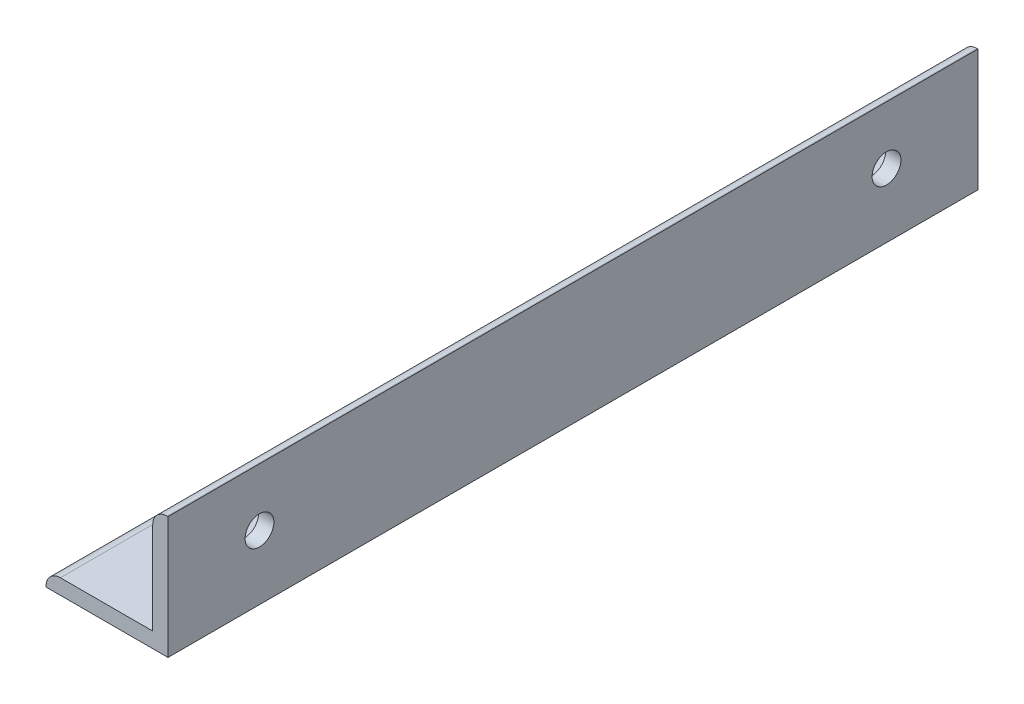
ISO-10303-21;
HEADER;
FILE_DESCRIPTION(('STEP AP214'),'2;1');
FILE_NAME('part.step','',(''),(''),'','','');
FILE_SCHEMA(('AUTOMOTIVE_DESIGN { 1 0 10303 214 1 1 1 1 }'));
ENDSEC;
DATA;
#1=APPLICATION_CONTEXT('core data for automotive mechanical design processes');
#2=APPLICATION_PROTOCOL_DEFINITION('international standard','automotive_design',2000,#1);
#3=PRODUCT_CONTEXT('',#1,'mechanical');
#4=PRODUCT('Part','Part','',(#3));
#5=PRODUCT_RELATED_PRODUCT_CATEGORY('part','',(#4));
#6=PRODUCT_DEFINITION_FORMATION('','',#4);
#7=PRODUCT_DEFINITION_CONTEXT('part definition',#1,'design');
#8=PRODUCT_DEFINITION('design','',#6,#7);
#9=PRODUCT_DEFINITION_SHAPE('','',#8);
#10=(LENGTH_UNIT() NAMED_UNIT(*) SI_UNIT(.MILLI.,.METRE.));
#11=(NAMED_UNIT(*) PLANE_ANGLE_UNIT() SI_UNIT($,.RADIAN.));
#12=(NAMED_UNIT(*) SI_UNIT($,.STERADIAN.) SOLID_ANGLE_UNIT());
#13=UNCERTAINTY_MEASURE_WITH_UNIT(LENGTH_MEASURE(1.E-05),#10,'distance_accuracy_value','');
#14=(GEOMETRIC_REPRESENTATION_CONTEXT(3) GLOBAL_UNCERTAINTY_ASSIGNED_CONTEXT((#13)) GLOBAL_UNIT_ASSIGNED_CONTEXT((#10,
#11,#12)) REPRESENTATION_CONTEXT('',''));
#15=CARTESIAN_POINT('',(0.,0.,0.));
#16=DIRECTION('',(0.,0.,1.));
#17=DIRECTION('',(1.,0.,0.));
#18=AXIS2_PLACEMENT_3D('',#15,#16,#17);
#19=CARTESIAN_POINT('',(99.1693578983799,36.201,-35.6390837190426));
#20=DIRECTION('',(0.,0.,-1.));
#21=DIRECTION('',(0.,1.,0.));
#22=AXIS2_PLACEMENT_3D('',#19,#20,#21);
#23=CYLINDRICAL_SURFACE('',#22,1.5);
#24=CARTESIAN_POINT('',(99.1693578983799,36.201,-35.6390837190426));
#25=DIRECTION('',(0.,0.,-1.));
#26=DIRECTION('',(0.,1.,0.));
#27=AXIS2_PLACEMENT_3D('',#24,#25,#26);
#28=CIRCLE('',#27,1.5);
#29=CARTESIAN_POINT('',(99.1693578983799,37.701,-35.6390837190426));
#30=VERTEX_POINT('',#29);
#31=CARTESIAN_POINT('',(97.6693578983799,36.201,-35.6390837190426));
#32=VERTEX_POINT('',#31);
#33=EDGE_CURVE('E105',#30,#32,#28,.F.);
#34=ORIENTED_EDGE('',*,*,#33,.F.);
#35=DIRECTION('',(0.,0.,1.));
#36=VECTOR('',#35,1.);
#37=CARTESIAN_POINT('',(99.1693578983799,37.701,-35.6390837190426));
#38=LINE('',#37,#36);
#39=CARTESIAN_POINT('',(99.1693578983799,37.701,-119.964083719043));
#40=VERTEX_POINT('',#39);
#41=EDGE_CURVE('E158',#40,#30,#38,.T.);
#42=ORIENTED_EDGE('',*,*,#41,.F.);
#43=CARTESIAN_POINT('',(99.1693578983799,36.201,-119.964083719043));
#44=DIRECTION('',(0.,0.,-1.));
#45=DIRECTION('',(0.,1.,0.));
#46=AXIS2_PLACEMENT_3D('',#43,#44,#45);
#47=CIRCLE('',#46,1.5);
#48=CARTESIAN_POINT('',(97.6693578983799,36.201,-119.964083719043));
#49=VERTEX_POINT('',#48);
#50=EDGE_CURVE('E90',#40,#49,#47,.F.);
#51=ORIENTED_EDGE('',*,*,#50,.T.);
#52=DIRECTION('',(0.,0.,1.));
#53=VECTOR('',#52,1.);
#54=CARTESIAN_POINT('',(97.6693578983799,36.201,-35.6390837190426));
#55=LINE('',#54,#53);
#56=EDGE_CURVE('E155',#32,#49,#55,.F.);
#57=ORIENTED_EDGE('',*,*,#56,.F.);
#58=EDGE_LOOP('',(#34,#42,#51,#57));
#59=FACE_BOUND('',#58,.T.);
#60=ADVANCED_FACE('F17',(#59),#23,.T.);
#61=CARTESIAN_POINT('',(110.28135789838,47.313,-35.6390837190426));
#62=DIRECTION('',(0.,0.,-1.));
#63=DIRECTION('',(0.,1.,0.));
#64=AXIS2_PLACEMENT_3D('',#61,#62,#63);
#65=CYLINDRICAL_SURFACE('',#64,1.5);
#66=CARTESIAN_POINT('',(110.28135789838,47.313,-35.6390837190426));
#67=DIRECTION('',(0.,0.,-1.));
#68=DIRECTION('',(0.,1.,0.));
#69=AXIS2_PLACEMENT_3D('',#66,#67,#68);
#70=CIRCLE('',#69,1.5);
#71=CARTESIAN_POINT('',(110.28135789838,48.813,-35.6390837190426));
#72=VERTEX_POINT('',#71);
#73=CARTESIAN_POINT('',(108.78135789838,47.313,-35.6390837190426));
#74=VERTEX_POINT('',#73);
#75=EDGE_CURVE('E85',#72,#74,#70,.F.);
#76=ORIENTED_EDGE('',*,*,#75,.F.);
#77=DIRECTION('',(0.,0.,1.));
#78=VECTOR('',#77,1.);
#79=CARTESIAN_POINT('',(110.28135789838,48.813,-35.6390837190426));
#80=LINE('',#79,#78);
#81=CARTESIAN_POINT('',(110.28135789838,48.813,-119.964083719043));
#82=VERTEX_POINT('',#81);
#83=EDGE_CURVE('E79',#82,#72,#80,.T.);
#84=ORIENTED_EDGE('',*,*,#83,.F.);
#85=CARTESIAN_POINT('',(110.28135789838,47.313,-119.964083719043));
#86=DIRECTION('',(0.,0.,-1.));
#87=DIRECTION('',(0.,1.,0.));
#88=AXIS2_PLACEMENT_3D('',#85,#86,#87);
#89=CIRCLE('',#88,1.5);
#90=CARTESIAN_POINT('',(108.78135789838,47.313,-119.964083719043));
#91=VERTEX_POINT('',#90);
#92=EDGE_CURVE('E82',#82,#91,#89,.F.);
#93=ORIENTED_EDGE('',*,*,#92,.T.);
#94=DIRECTION('',(0.,0.,1.));
#95=VECTOR('',#94,1.);
#96=CARTESIAN_POINT('',(108.78135789838,47.313,-35.6390837190426));
#97=LINE('',#96,#95);
#98=EDGE_CURVE('E149',#74,#91,#97,.F.);
#99=ORIENTED_EDGE('',*,*,#98,.F.);
#100=EDGE_LOOP('',(#76,#84,#93,#99));
#101=FACE_BOUND('',#100,.T.);
#102=ADVANCED_FACE('F81',(#101),#65,.T.);
#103=CARTESIAN_POINT('',(94.4943578983799,37.701,-35.6390837190426));
#104=DIRECTION('',(0.,1.,0.));
#105=DIRECTION('',(0.,0.,1.));
#106=AXIS2_PLACEMENT_3D('',#103,#104,#105);
#107=PLANE('',#106);
#108=CARTESIAN_POINT('',(103.66935789838,37.701,-100.914083719043));
#109=DIRECTION('',(0.,-1.,0.));
#110=DIRECTION('',(1.,0.,0.));
#111=AXIS2_PLACEMENT_3D('',#108,#109,#110);
#112=CIRCLE('',#111,1.5);
#113=CARTESIAN_POINT('',(105.16935789838,37.701,-100.914083719043));
#114=VERTEX_POINT('',#113);
#115=EDGE_CURVE('E20',#114,#114,#112,.T.);
#116=ORIENTED_EDGE('',*,*,#115,.T.);
#117=EDGE_LOOP('',(#116));
#118=FACE_BOUND('',#117,.T.);
#119=CARTESIAN_POINT('',(103.66935789838,37.701,-54.6890837190426));
#120=DIRECTION('',(0.,-1.,0.));
#121=DIRECTION('',(1.,0.,0.));
#122=AXIS2_PLACEMENT_3D('',#119,#120,#121);
#123=CIRCLE('',#122,1.5);
#124=CARTESIAN_POINT('',(105.16935789838,37.701,-54.6890837190426));
#125=VERTEX_POINT('',#124);
#126=EDGE_CURVE('E147',#125,#125,#123,.T.);
#127=ORIENTED_EDGE('',*,*,#126,.T.);
#128=EDGE_LOOP('',(#127));
#129=FACE_BOUND('',#128,.T.);
#130=DIRECTION('',(0.,0.,1.));
#131=VECTOR('',#130,1.);
#132=CARTESIAN_POINT('',(108.78135789838,37.701,-35.6390837190426));
#133=LINE('',#132,#131);
#134=CARTESIAN_POINT('',(108.78135789838,37.701,-119.964083719043));
#135=VERTEX_POINT('',#134);
#136=CARTESIAN_POINT('',(108.78135789838,37.701,-35.6390837190426));
#137=VERTEX_POINT('',#136);
#138=EDGE_CURVE('E152',#135,#137,#133,.T.);
#139=ORIENTED_EDGE('',*,*,#138,.F.);
#140=DIRECTION('',(1.,0.,0.));
#141=VECTOR('',#140,1.);
#142=CARTESIAN_POINT('',(102.43185789838,37.701,-119.964083719043));
#143=LINE('',#142,#141);
#144=EDGE_CURVE('E146',#135,#40,#143,.F.);
#145=ORIENTED_EDGE('',*,*,#144,.T.);
#146=ORIENTED_EDGE('',*,*,#41,.T.);
#147=DIRECTION('',(1.,0.,0.));
#148=VECTOR('',#147,1.);
#149=CARTESIAN_POINT('',(102.43185789838,37.701,-35.6390837190426));
#150=LINE('',#149,#148);
#151=EDGE_CURVE('E124',#137,#30,#150,.F.);
#152=ORIENTED_EDGE('',*,*,#151,.F.);
#153=EDGE_LOOP('',(#139,#145,#146,#152));
#154=FACE_BOUND('',#153,.T.);
#155=ADVANCED_FACE('F215',(#118,#129,#154),#107,.T.);
#156=CARTESIAN_POINT('',(97.6693578983799,36.113,-35.6390837190426));
#157=DIRECTION('',(-1.,0.,0.));
#158=DIRECTION('',(0.,0.,1.));
#159=AXIS2_PLACEMENT_3D('',#156,#157,#158);
#160=PLANE('',#159);
#161=DIRECTION('',(0.,0.,-1.));
#162=VECTOR('',#161,1.);
#163=CARTESIAN_POINT('',(97.6693578983799,36.113,-35.6390837190426));
#164=LINE('',#163,#162);
#165=CARTESIAN_POINT('',(97.6693578983799,36.113,-35.6390837190426));
#166=VERTEX_POINT('',#165);
#167=CARTESIAN_POINT('',(97.6693578983799,36.113,-119.964083719043));
#168=VERTEX_POINT('',#167);
#169=EDGE_CURVE('E141',#166,#168,#164,.T.);
#170=ORIENTED_EDGE('',*,*,#169,.F.);
#171=DIRECTION('',(0.,-1.,0.));
#172=VECTOR('',#171,1.);
#173=CARTESIAN_POINT('',(97.6693578983799,44.0505,-35.6390837190426));
#174=LINE('',#173,#172);
#175=EDGE_CURVE('E108',#32,#166,#174,.T.);
#176=ORIENTED_EDGE('',*,*,#175,.F.);
#177=ORIENTED_EDGE('',*,*,#56,.T.);
#178=DIRECTION('',(0.,1.,0.));
#179=VECTOR('',#178,1.);
#180=CARTESIAN_POINT('',(97.6693578983799,44.0505,-119.964083719043));
#181=LINE('',#180,#179);
#182=EDGE_CURVE('E99',#49,#168,#181,.F.);
#183=ORIENTED_EDGE('',*,*,#182,.T.);
#184=EDGE_LOOP('',(#170,#176,#177,#183));
#185=FACE_BOUND('',#184,.T.);
#186=ADVANCED_FACE('F219',(#185),#160,.T.);
#187=CARTESIAN_POINT('',(103.66935789838,37.701,-100.914083719043));
#188=DIRECTION('',(0.,-1.,0.));
#189=DIRECTION('',(1.,0.,0.));
#190=AXIS2_PLACEMENT_3D('',#187,#188,#189);
#191=CYLINDRICAL_SURFACE('',#190,1.5);
#192=ORIENTED_EDGE('',*,*,#115,.F.);
#193=EDGE_LOOP('',(#192));
#194=FACE_BOUND('',#193,.T.);
#195=CARTESIAN_POINT('',(103.66935789838,36.113,-100.914083719043));
#196=DIRECTION('',(0.,-1.,0.));
#197=DIRECTION('',(1.,0.,0.));
#198=AXIS2_PLACEMENT_3D('',#195,#196,#197);
#199=CIRCLE('',#198,1.5);
#200=CARTESIAN_POINT('',(105.16935789838,36.113,-100.914083719043));
#201=VERTEX_POINT('',#200);
#202=EDGE_CURVE('E138',#201,#201,#199,.F.);
#203=ORIENTED_EDGE('',*,*,#202,.F.);
#204=EDGE_LOOP('',(#203));
#205=FACE_BOUND('',#204,.T.);
#206=ADVANCED_FACE('F221',(#194,#205),#191,.F.);
#207=CARTESIAN_POINT('',(103.66935789838,37.701,-54.6890837190426));
#208=DIRECTION('',(0.,-1.,0.));
#209=DIRECTION('',(1.,0.,0.));
#210=AXIS2_PLACEMENT_3D('',#207,#208,#209);
#211=CYLINDRICAL_SURFACE('',#210,1.5);
#212=ORIENTED_EDGE('',*,*,#126,.F.);
#213=EDGE_LOOP('',(#212));
#214=FACE_BOUND('',#213,.T.);
#215=CARTESIAN_POINT('',(103.66935789838,36.113,-54.6890837190426));
#216=DIRECTION('',(0.,-1.,0.));
#217=DIRECTION('',(1.,0.,0.));
#218=AXIS2_PLACEMENT_3D('',#215,#216,#217);
#219=CIRCLE('',#218,1.5);
#220=CARTESIAN_POINT('',(105.16935789838,36.113,-54.6890837190426));
#221=VERTEX_POINT('',#220);
#222=EDGE_CURVE('E135',#221,#221,#219,.F.);
#223=ORIENTED_EDGE('',*,*,#222,.F.);
#224=EDGE_LOOP('',(#223));
#225=FACE_BOUND('',#224,.T.);
#226=ADVANCED_FACE('F228',(#214,#225),#211,.F.);
#227=CARTESIAN_POINT('',(108.78135789838,37.701,-35.6390837190426));
#228=DIRECTION('',(-1.,0.,0.));
#229=DIRECTION('',(0.,0.,1.));
#230=AXIS2_PLACEMENT_3D('',#227,#228,#229);
#231=PLANE('',#230);
#232=CARTESIAN_POINT('',(108.78135789838,42.813,-45.1640837190426));
#233=DIRECTION('',(1.,0.,0.));
#234=DIRECTION('',(0.,0.,-1.));
#235=AXIS2_PLACEMENT_3D('',#232,#233,#234);
#236=CIRCLE('',#235,1.5);
#237=CARTESIAN_POINT('',(108.78135789838,42.813,-46.6640837190426));
#238=VERTEX_POINT('',#237);
#239=EDGE_CURVE('E132',#238,#238,#236,.T.);
#240=ORIENTED_EDGE('',*,*,#239,.T.);
#241=EDGE_LOOP('',(#240));
#242=FACE_BOUND('',#241,.T.);
#243=CARTESIAN_POINT('',(108.78135789838,42.813,-110.439083719043));
#244=DIRECTION('',(1.,0.,0.));
#245=DIRECTION('',(0.,0.,-1.));
#246=AXIS2_PLACEMENT_3D('',#243,#244,#245);
#247=CIRCLE('',#246,1.5);
#248=CARTESIAN_POINT('',(108.78135789838,42.813,-111.939083719043));
#249=VERTEX_POINT('',#248);
#250=EDGE_CURVE('E118',#249,#249,#247,.T.);
#251=ORIENTED_EDGE('',*,*,#250,.T.);
#252=EDGE_LOOP('',(#251));
#253=FACE_BOUND('',#252,.T.);
#254=ORIENTED_EDGE('',*,*,#138,.T.);
#255=DIRECTION('',(0.,-1.,0.));
#256=VECTOR('',#255,1.);
#257=CARTESIAN_POINT('',(108.78135789838,44.0505,-35.6390837190426));
#258=LINE('',#257,#256);
#259=EDGE_CURVE('E142',#74,#137,#258,.T.);
#260=ORIENTED_EDGE('',*,*,#259,.F.);
#261=ORIENTED_EDGE('',*,*,#98,.T.);
#262=DIRECTION('',(0.,1.,0.));
#263=VECTOR('',#262,1.);
#264=CARTESIAN_POINT('',(108.78135789838,44.0505,-119.964083719043));
#265=LINE('',#264,#263);
#266=EDGE_CURVE('E98',#91,#135,#265,.F.);
#267=ORIENTED_EDGE('',*,*,#266,.T.);
#268=EDGE_LOOP('',(#254,#260,#261,#267));
#269=FACE_BOUND('',#268,.T.);
#270=ADVANCED_FACE('F256',(#242,#253,#269),#231,.T.);
#271=CARTESIAN_POINT('',(102.43185789838,44.0505,-119.964083719043));
#272=DIRECTION('',(0.,0.,1.));
#273=DIRECTION('',(1.,0.,0.));
#274=AXIS2_PLACEMENT_3D('',#271,#272,#273);
#275=PLANE('',#274);
#276=ORIENTED_EDGE('',*,*,#144,.F.);
#277=ORIENTED_EDGE('',*,*,#266,.F.);
#278=ORIENTED_EDGE('',*,*,#92,.F.);
#279=DIRECTION('',(1.,0.,0.));
#280=VECTOR('',#279,1.);
#281=CARTESIAN_POINT('',(108.78135789838,48.813,-119.964083719043));
#282=LINE('',#281,#280);
#283=CARTESIAN_POINT('',(110.36935789838,48.813,-119.964083719043));
#284=VERTEX_POINT('',#283);
#285=EDGE_CURVE('E89',#284,#82,#282,.F.);
#286=ORIENTED_EDGE('',*,*,#285,.F.);
#287=DIRECTION('',(0.,1.,0.));
#288=VECTOR('',#287,1.);
#289=CARTESIAN_POINT('',(110.36935789838,51.988,-119.964083719043));
#290=LINE('',#289,#288);
#291=CARTESIAN_POINT('',(110.36935789838,36.113,-119.964083719043));
#292=VERTEX_POINT('',#291);
#293=EDGE_CURVE('E116',#292,#284,#290,.T.);
#294=ORIENTED_EDGE('',*,*,#293,.F.);
#295=DIRECTION('',(1.,0.,0.));
#296=VECTOR('',#295,1.);
#297=CARTESIAN_POINT('',(110.36935789838,36.113,-119.964083719043));
#298=LINE('',#297,#296);
#299=EDGE_CURVE('E121',#168,#292,#298,.T.);
#300=ORIENTED_EDGE('',*,*,#299,.F.);
#301=ORIENTED_EDGE('',*,*,#182,.F.);
#302=ORIENTED_EDGE('',*,*,#50,.F.);
#303=EDGE_LOOP('',(#276,#277,#278,#286,#294,#300,#301,#302));
#304=FACE_BOUND('',#303,.T.);
#305=ADVANCED_FACE('F95',(#304),#275,.F.);
#306=CARTESIAN_POINT('',(108.78135789838,48.813,-35.6390837190426));
#307=DIRECTION('',(0.,1.,0.));
#308=DIRECTION('',(0.,0.,1.));
#309=AXIS2_PLACEMENT_3D('',#306,#307,#308);
#310=PLANE('',#309);
#311=DIRECTION('',(0.,0.,-1.));
#312=VECTOR('',#311,1.);
#313=CARTESIAN_POINT('',(110.36935789838,48.813,-35.6390837190426));
#314=LINE('',#313,#312);
#315=CARTESIAN_POINT('',(110.36935789838,48.813,-35.6390837190426));
#316=VERTEX_POINT('',#315);
#317=EDGE_CURVE('E103',#284,#316,#314,.F.);
#318=ORIENTED_EDGE('',*,*,#317,.F.);
#319=ORIENTED_EDGE('',*,*,#285,.T.);
#320=ORIENTED_EDGE('',*,*,#83,.T.);
#321=DIRECTION('',(1.,0.,0.));
#322=VECTOR('',#321,1.);
#323=CARTESIAN_POINT('',(102.43185789838,48.813,-35.6390837190426));
#324=LINE('',#323,#322);
#325=EDGE_CURVE('E143',#316,#72,#324,.F.);
#326=ORIENTED_EDGE('',*,*,#325,.F.);
#327=EDGE_LOOP('',(#318,#319,#320,#326));
#328=FACE_BOUND('',#327,.T.);
#329=ADVANCED_FACE('F101',(#328),#310,.T.);
#330=CARTESIAN_POINT('',(102.43185789838,44.0505,-35.6390837190426));
#331=DIRECTION('',(0.,0.,1.));
#332=DIRECTION('',(0.,-1.,0.));
#333=AXIS2_PLACEMENT_3D('',#330,#331,#332);
#334=PLANE('',#333);
#335=ORIENTED_EDGE('',*,*,#259,.T.);
#336=ORIENTED_EDGE('',*,*,#151,.T.);
#337=ORIENTED_EDGE('',*,*,#33,.T.);
#338=ORIENTED_EDGE('',*,*,#175,.T.);
#339=DIRECTION('',(1.,0.,0.));
#340=VECTOR('',#339,1.);
#341=CARTESIAN_POINT('',(110.36935789838,36.113,-35.6390837190426));
#342=LINE('',#341,#340);
#343=CARTESIAN_POINT('',(110.36935789838,36.113,-35.6390837190426));
#344=VERTEX_POINT('',#343);
#345=EDGE_CURVE('E35',#344,#166,#342,.F.);
#346=ORIENTED_EDGE('',*,*,#345,.F.);
#347=DIRECTION('',(0.,1.,0.));
#348=VECTOR('',#347,1.);
#349=CARTESIAN_POINT('',(110.36935789838,51.988,-35.6390837190426));
#350=LINE('',#349,#348);
#351=EDGE_CURVE('E178',#316,#344,#350,.F.);
#352=ORIENTED_EDGE('',*,*,#351,.F.);
#353=ORIENTED_EDGE('',*,*,#325,.T.);
#354=ORIENTED_EDGE('',*,*,#75,.T.);
#355=EDGE_LOOP('',(#335,#336,#337,#338,#346,#352,#353,#354));
#356=FACE_BOUND('',#355,.T.);
#357=ADVANCED_FACE('F212',(#356),#334,.T.);
#358=CARTESIAN_POINT('',(110.36935789838,36.113,-35.6390837190426));
#359=DIRECTION('',(0.,-1.,0.));
#360=DIRECTION('',(0.,0.,-1.));
#361=AXIS2_PLACEMENT_3D('',#358,#359,#360);
#362=PLANE('',#361);
#363=ORIENTED_EDGE('',*,*,#222,.T.);
#364=EDGE_LOOP('',(#363));
#365=FACE_BOUND('',#364,.T.);
#366=ORIENTED_EDGE('',*,*,#202,.T.);
#367=EDGE_LOOP('',(#366));
#368=FACE_BOUND('',#367,.T.);
#369=ORIENTED_EDGE('',*,*,#345,.T.);
#370=ORIENTED_EDGE('',*,*,#169,.T.);
#371=ORIENTED_EDGE('',*,*,#299,.T.);
#372=DIRECTION('',(0.,0.,-1.));
#373=VECTOR('',#372,1.);
#374=CARTESIAN_POINT('',(110.36935789838,36.113,-35.6390837190426));
#375=LINE('',#374,#373);
#376=EDGE_CURVE('E129',#344,#292,#375,.T.);
#377=ORIENTED_EDGE('',*,*,#376,.F.);
#378=EDGE_LOOP('',(#369,#370,#371,#377));
#379=FACE_BOUND('',#378,.T.);
#380=ADVANCED_FACE('F172',(#365,#368,#379),#362,.T.);
#381=CARTESIAN_POINT('',(108.78135789838,42.813,-45.1640837190426));
#382=DIRECTION('',(1.,0.,0.));
#383=DIRECTION('',(0.,0.,-1.));
#384=AXIS2_PLACEMENT_3D('',#381,#382,#383);
#385=CYLINDRICAL_SURFACE('',#384,1.5);
#386=ORIENTED_EDGE('',*,*,#239,.F.);
#387=EDGE_LOOP('',(#386));
#388=FACE_BOUND('',#387,.T.);
#389=CARTESIAN_POINT('',(110.36935789838,42.813,-45.1640837190426));
#390=DIRECTION('',(1.,0.,0.));
#391=DIRECTION('',(0.,0.,-1.));
#392=AXIS2_PLACEMENT_3D('',#389,#390,#391);
#393=CIRCLE('',#392,1.5);
#394=CARTESIAN_POINT('',(110.36935789838,42.813,-46.6640837190426));
#395=VERTEX_POINT('',#394);
#396=EDGE_CURVE('E26',#395,#395,#393,.F.);
#397=ORIENTED_EDGE('',*,*,#396,.F.);
#398=EDGE_LOOP('',(#397));
#399=FACE_BOUND('',#398,.T.);
#400=ADVANCED_FACE('F239',(#388,#399),#385,.F.);
#401=CARTESIAN_POINT('',(108.78135789838,42.813,-110.439083719043));
#402=DIRECTION('',(1.,0.,0.));
#403=DIRECTION('',(0.,0.,-1.));
#404=AXIS2_PLACEMENT_3D('',#401,#402,#403);
#405=CYLINDRICAL_SURFACE('',#404,1.5);
#406=ORIENTED_EDGE('',*,*,#250,.F.);
#407=EDGE_LOOP('',(#406));
#408=FACE_BOUND('',#407,.T.);
#409=CARTESIAN_POINT('',(110.36935789838,42.813,-110.439083719043));
#410=DIRECTION('',(1.,0.,0.));
#411=DIRECTION('',(0.,0.,-1.));
#412=AXIS2_PLACEMENT_3D('',#409,#410,#411);
#413=CIRCLE('',#412,1.5);
#414=CARTESIAN_POINT('',(110.36935789838,42.813,-111.939083719043));
#415=VERTEX_POINT('',#414);
#416=EDGE_CURVE('E11',#415,#415,#413,.F.);
#417=ORIENTED_EDGE('',*,*,#416,.F.);
#418=EDGE_LOOP('',(#417));
#419=FACE_BOUND('',#418,.T.);
#420=ADVANCED_FACE('F233',(#408,#419),#405,.F.);
#421=CARTESIAN_POINT('',(110.36935789838,51.988,-35.6390837190426));
#422=DIRECTION('',(1.,0.,0.));
#423=DIRECTION('',(0.,0.,-1.));
#424=AXIS2_PLACEMENT_3D('',#421,#422,#423);
#425=PLANE('',#424);
#426=ORIENTED_EDGE('',*,*,#416,.T.);
#427=EDGE_LOOP('',(#426));
#428=FACE_BOUND('',#427,.T.);
#429=ORIENTED_EDGE('',*,*,#396,.T.);
#430=EDGE_LOOP('',(#429));
#431=FACE_BOUND('',#430,.T.);
#432=ORIENTED_EDGE('',*,*,#351,.T.);
#433=ORIENTED_EDGE('',*,*,#376,.T.);
#434=ORIENTED_EDGE('',*,*,#293,.T.);
#435=ORIENTED_EDGE('',*,*,#317,.T.);
#436=EDGE_LOOP('',(#432,#433,#434,#435));
#437=FACE_BOUND('',#436,.T.);
#438=ADVANCED_FACE('F180',(#428,#431,#437),#425,.T.);
#439=CLOSED_SHELL('',(#60,#102,#155,#186,#206,#226,#270,#305,#329,#357,#380,#400,#420,#438));
#440=MANIFOLD_SOLID_BREP('B1',#439);
#441=ADVANCED_BREP_SHAPE_REPRESENTATION('',(#18,#440),#14);
#442=SHAPE_DEFINITION_REPRESENTATION(#9,#441);
ENDSEC;
END-ISO-10303-21;
